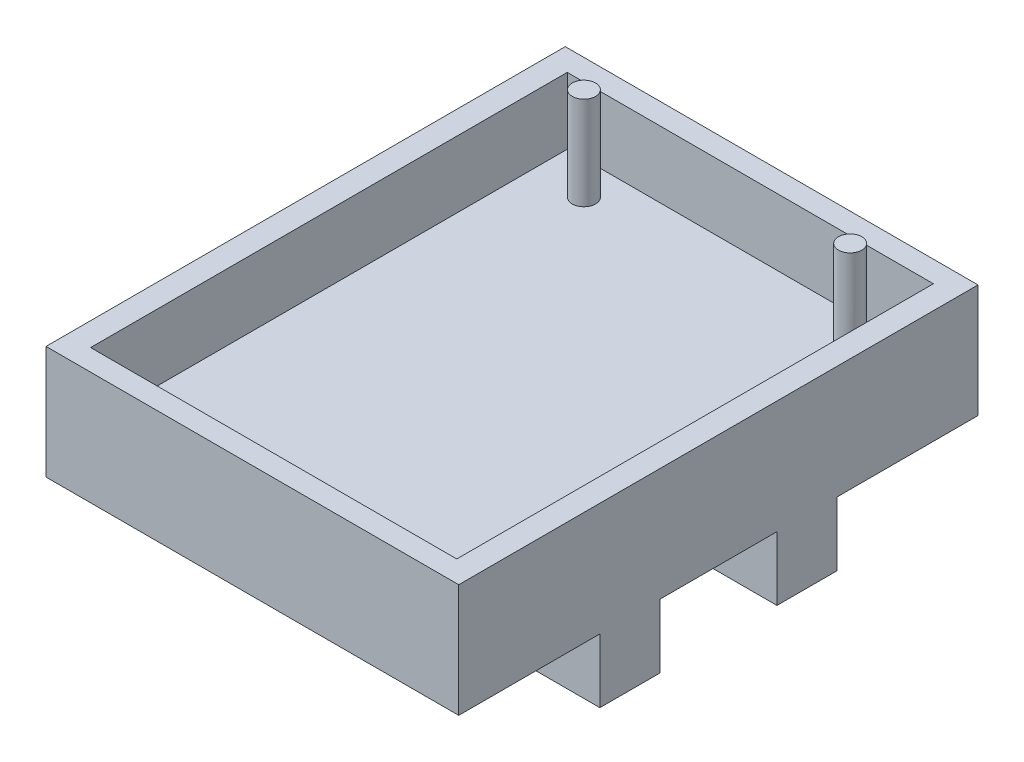
ISO-10303-21;
HEADER;
FILE_DESCRIPTION(('STEP AP214'),'2;1');
FILE_NAME('part.step','',(''),(''),'','','');
FILE_SCHEMA(('AUTOMOTIVE_DESIGN { 1 0 10303 214 1 1 1 1 }'));
ENDSEC;
DATA;
#1=APPLICATION_CONTEXT('core data for automotive mechanical design processes');
#2=APPLICATION_PROTOCOL_DEFINITION('international standard','automotive_design',2000,#1);
#3=PRODUCT_CONTEXT('',#1,'mechanical');
#4=PRODUCT('Part','Part','',(#3));
#5=PRODUCT_RELATED_PRODUCT_CATEGORY('part','',(#4));
#6=PRODUCT_DEFINITION_FORMATION('','',#4);
#7=PRODUCT_DEFINITION_CONTEXT('part definition',#1,'design');
#8=PRODUCT_DEFINITION('design','',#6,#7);
#9=PRODUCT_DEFINITION_SHAPE('','',#8);
#10=(LENGTH_UNIT() NAMED_UNIT(*) SI_UNIT(.MILLI.,.METRE.));
#11=(NAMED_UNIT(*) PLANE_ANGLE_UNIT() SI_UNIT($,.RADIAN.));
#12=(NAMED_UNIT(*) SI_UNIT($,.STERADIAN.) SOLID_ANGLE_UNIT());
#13=UNCERTAINTY_MEASURE_WITH_UNIT(LENGTH_MEASURE(1.E-05),#10,'distance_accuracy_value','');
#14=(GEOMETRIC_REPRESENTATION_CONTEXT(3) GLOBAL_UNCERTAINTY_ASSIGNED_CONTEXT((#13)) GLOBAL_UNIT_ASSIGNED_CONTEXT((#10,
#11,#12)) REPRESENTATION_CONTEXT('',''));
#15=CARTESIAN_POINT('',(0.,0.,0.));
#16=DIRECTION('',(0.,0.,1.));
#17=DIRECTION('',(1.,0.,0.));
#18=AXIS2_PLACEMENT_3D('',#15,#16,#17);
#19=CARTESIAN_POINT('',(0.,0.,0.));
#20=DIRECTION('',(0.,-1.,0.));
#21=DIRECTION('',(0.,0.,-1.));
#22=AXIS2_PLACEMENT_3D('',#19,#20,#21);
#23=PLANE('',#22);
#24=DIRECTION('',(-1.,0.,0.));
#25=VECTOR('',#24,1.);
#26=CARTESIAN_POINT('',(-15.5,0.,-8.9));
#27=LINE('',#26,#25);
#28=CARTESIAN_POINT('',(15.5,0.,-8.9));
#29=VERTEX_POINT('',#28);
#30=CARTESIAN_POINT('',(-15.5,0.,-8.9));
#31=VERTEX_POINT('',#30);
#32=EDGE_CURVE('E190',#29,#31,#27,.T.);
#33=ORIENTED_EDGE('',*,*,#32,.T.);
#34=DIRECTION('',(0.,0.,1.));
#35=VECTOR('',#34,1.);
#36=CARTESIAN_POINT('',(-15.5,0.,19.5));
#37=LINE('',#36,#35);
#38=CARTESIAN_POINT('',(-15.5,0.,-19.5));
#39=VERTEX_POINT('',#38);
#40=EDGE_CURVE('E265',#39,#31,#37,.T.);
#41=ORIENTED_EDGE('',*,*,#40,.F.);
#42=DIRECTION('',(-1.,0.,0.));
#43=VECTOR('',#42,1.);
#44=CARTESIAN_POINT('',(-15.5,0.,-19.5));
#45=LINE('',#44,#43);
#46=CARTESIAN_POINT('',(15.5,0.,-19.5));
#47=VERTEX_POINT('',#46);
#48=EDGE_CURVE('E261',#47,#39,#45,.T.);
#49=ORIENTED_EDGE('',*,*,#48,.F.);
#50=DIRECTION('',(0.,0.,-1.));
#51=VECTOR('',#50,1.);
#52=CARTESIAN_POINT('',(15.5,0.,19.5));
#53=LINE('',#52,#51);
#54=EDGE_CURVE('E62',#29,#47,#53,.T.);
#55=ORIENTED_EDGE('',*,*,#54,.F.);
#56=EDGE_LOOP('',(#33,#41,#49,#55));
#57=FACE_BOUND('',#56,.T.);
#58=ADVANCED_FACE('F39',(#57),#23,.T.);
#59=DIRECTION('',(-1.,0.,0.));
#60=VECTOR('',#59,1.);
#61=CARTESIAN_POINT('',(-15.5,0.,8.9));
#62=LINE('',#61,#60);
#63=CARTESIAN_POINT('',(15.5,0.,8.9));
#64=VERTEX_POINT('',#63);
#65=CARTESIAN_POINT('',(-15.5,0.,8.9));
#66=VERTEX_POINT('',#65);
#67=EDGE_CURVE('E225',#64,#66,#62,.T.);
#68=ORIENTED_EDGE('',*,*,#67,.F.);
#69=CARTESIAN_POINT('',(15.5,0.,19.5));
#70=VERTEX_POINT('',#69);
#71=EDGE_CURVE('E258',#70,#64,#53,.T.);
#72=ORIENTED_EDGE('',*,*,#71,.F.);
#73=DIRECTION('',(1.,0.,0.));
#74=VECTOR('',#73,1.);
#75=CARTESIAN_POINT('',(-15.5,0.,19.5));
#76=LINE('',#75,#74);
#77=CARTESIAN_POINT('',(-15.5,0.,19.5));
#78=VERTEX_POINT('',#77);
#79=EDGE_CURVE('E251',#78,#70,#76,.T.);
#80=ORIENTED_EDGE('',*,*,#79,.F.);
#81=EDGE_CURVE('E264',#66,#78,#37,.T.);
#82=ORIENTED_EDGE('',*,*,#81,.F.);
#83=EDGE_LOOP('',(#68,#72,#80,#82));
#84=FACE_BOUND('',#83,.T.);
#85=ADVANCED_FACE('F300',(#84),#23,.T.);
#86=CARTESIAN_POINT('',(15.5,8.5,19.5));
#87=DIRECTION('',(-1.,0.,0.));
#88=DIRECTION('',(0.,0.,1.));
#89=AXIS2_PLACEMENT_3D('',#86,#87,#88);
#90=PLANE('',#89);
#91=ORIENTED_EDGE('',*,*,#71,.T.);
#92=DIRECTION('',(0.,1.,0.));
#93=VECTOR('',#92,1.);
#94=CARTESIAN_POINT('',(15.5,-4.8,8.9));
#95=LINE('',#94,#93);
#96=CARTESIAN_POINT('',(15.5,-4.8,8.9));
#97=VERTEX_POINT('',#96);
#98=EDGE_CURVE('E238',#97,#64,#95,.T.);
#99=ORIENTED_EDGE('',*,*,#98,.F.);
#100=DIRECTION('',(0.,0.,1.));
#101=VECTOR('',#100,1.);
#102=CARTESIAN_POINT('',(15.5,-4.8,4.4));
#103=LINE('',#102,#101);
#104=CARTESIAN_POINT('',(15.5,-4.8,4.4));
#105=VERTEX_POINT('',#104);
#106=EDGE_CURVE('E227',#105,#97,#103,.T.);
#107=ORIENTED_EDGE('',*,*,#106,.F.);
#108=DIRECTION('',(0.,1.,0.));
#109=VECTOR('',#108,1.);
#110=CARTESIAN_POINT('',(15.5,-4.8,4.4));
#111=LINE('',#110,#109);
#112=CARTESIAN_POINT('',(15.5,0.,4.4));
#113=VERTEX_POINT('',#112);
#114=EDGE_CURVE('E241',#105,#113,#111,.T.);
#115=ORIENTED_EDGE('',*,*,#114,.T.);
#116=CARTESIAN_POINT('',(15.5,0.,-4.4));
#117=VERTEX_POINT('',#116);
#118=EDGE_CURVE('E262',#113,#117,#53,.T.);
#119=ORIENTED_EDGE('',*,*,#118,.T.);
#120=DIRECTION('',(0.,1.,0.));
#121=VECTOR('',#120,1.);
#122=CARTESIAN_POINT('',(15.5,-4.8,-4.4));
#123=LINE('',#122,#121);
#124=CARTESIAN_POINT('',(15.5,-4.8,-4.4));
#125=VERTEX_POINT('',#124);
#126=EDGE_CURVE('E212',#125,#117,#123,.T.);
#127=ORIENTED_EDGE('',*,*,#126,.F.);
#128=DIRECTION('',(0.,0.,-1.));
#129=VECTOR('',#128,1.);
#130=CARTESIAN_POINT('',(15.5,-4.8,-4.4));
#131=LINE('',#130,#129);
#132=CARTESIAN_POINT('',(15.5,-4.8,-8.9));
#133=VERTEX_POINT('',#132);
#134=EDGE_CURVE('E201',#125,#133,#131,.T.);
#135=ORIENTED_EDGE('',*,*,#134,.T.);
#136=DIRECTION('',(0.,1.,0.));
#137=VECTOR('',#136,1.);
#138=CARTESIAN_POINT('',(15.5,-4.8,-8.9));
#139=LINE('',#138,#137);
#140=EDGE_CURVE('E215',#133,#29,#139,.T.);
#141=ORIENTED_EDGE('',*,*,#140,.T.);
#142=ORIENTED_EDGE('',*,*,#54,.T.);
#143=DIRECTION('',(0.,-1.,0.));
#144=VECTOR('',#143,1.);
#145=CARTESIAN_POINT('',(15.5,8.5,-19.5));
#146=LINE('',#145,#144);
#147=CARTESIAN_POINT('',(15.5,8.5,-19.5));
#148=VERTEX_POINT('',#147);
#149=EDGE_CURVE('E278',#148,#47,#146,.T.);
#150=ORIENTED_EDGE('',*,*,#149,.F.);
#151=DIRECTION('',(0.,0.,-1.));
#152=VECTOR('',#151,1.);
#153=CARTESIAN_POINT('',(15.5,8.5,19.5));
#154=LINE('',#153,#152);
#155=CARTESIAN_POINT('',(15.5,8.5,19.5));
#156=VERTEX_POINT('',#155);
#157=EDGE_CURVE('E247',#156,#148,#154,.T.);
#158=ORIENTED_EDGE('',*,*,#157,.F.);
#159=DIRECTION('',(0.,-1.,0.));
#160=VECTOR('',#159,1.);
#161=CARTESIAN_POINT('',(15.5,8.5,19.5));
#162=LINE('',#161,#160);
#163=EDGE_CURVE('E257',#156,#70,#162,.T.);
#164=ORIENTED_EDGE('',*,*,#163,.T.);
#165=EDGE_LOOP('',(#91,#99,#107,#115,#119,#127,#135,#141,#142,#150,#158,#164));
#166=FACE_BOUND('',#165,.T.);
#167=ADVANCED_FACE('F41',(#166),#90,.F.);
#168=CARTESIAN_POINT('',(-15.5,8.5,-19.5));
#169=DIRECTION('',(0.,0.,1.));
#170=DIRECTION('',(1.,0.,0.));
#171=AXIS2_PLACEMENT_3D('',#168,#169,#170);
#172=PLANE('',#171);
#173=ORIENTED_EDGE('',*,*,#48,.T.);
#174=DIRECTION('',(0.,-1.,0.));
#175=VECTOR('',#174,1.);
#176=CARTESIAN_POINT('',(-15.5,8.5,-19.5));
#177=LINE('',#176,#175);
#178=CARTESIAN_POINT('',(-15.5,8.5,-19.5));
#179=VERTEX_POINT('',#178);
#180=EDGE_CURVE('E275',#179,#39,#177,.T.);
#181=ORIENTED_EDGE('',*,*,#180,.F.);
#182=DIRECTION('',(-1.,0.,0.));
#183=VECTOR('',#182,1.);
#184=CARTESIAN_POINT('',(-15.5,8.5,-19.5));
#185=LINE('',#184,#183);
#186=EDGE_CURVE('E250',#148,#179,#185,.T.);
#187=ORIENTED_EDGE('',*,*,#186,.F.);
#188=ORIENTED_EDGE('',*,*,#149,.T.);
#189=EDGE_LOOP('',(#173,#181,#187,#188));
#190=FACE_BOUND('',#189,.T.);
#191=ADVANCED_FACE('F347',(#190),#172,.F.);
#192=CARTESIAN_POINT('',(-15.5,8.5,19.5));
#193=DIRECTION('',(1.,0.,0.));
#194=DIRECTION('',(0.,0.,-1.));
#195=AXIS2_PLACEMENT_3D('',#192,#193,#194);
#196=PLANE('',#195);
#197=ORIENTED_EDGE('',*,*,#40,.T.);
#198=DIRECTION('',(0.,1.,0.));
#199=VECTOR('',#198,1.);
#200=CARTESIAN_POINT('',(-15.5,-4.8,-8.9));
#201=LINE('',#200,#199);
#202=CARTESIAN_POINT('',(-15.5,-4.8,-8.9));
#203=VERTEX_POINT('',#202);
#204=EDGE_CURVE('E217',#203,#31,#201,.T.);
#205=ORIENTED_EDGE('',*,*,#204,.F.);
#206=DIRECTION('',(0.,0.,1.));
#207=VECTOR('',#206,1.);
#208=CARTESIAN_POINT('',(-15.5,-4.8,-4.4));
#209=LINE('',#208,#207);
#210=CARTESIAN_POINT('',(-15.5,-4.8,-4.4));
#211=VERTEX_POINT('',#210);
#212=EDGE_CURVE('E194',#203,#211,#209,.T.);
#213=ORIENTED_EDGE('',*,*,#212,.T.);
#214=DIRECTION('',(0.,1.,0.));
#215=VECTOR('',#214,1.);
#216=CARTESIAN_POINT('',(-15.5,-4.8,-4.4));
#217=LINE('',#216,#215);
#218=CARTESIAN_POINT('',(-15.5,0.,-4.4));
#219=VERTEX_POINT('',#218);
#220=EDGE_CURVE('E207',#211,#219,#217,.T.);
#221=ORIENTED_EDGE('',*,*,#220,.T.);
#222=CARTESIAN_POINT('',(-15.5,0.,4.4));
#223=VERTEX_POINT('',#222);
#224=EDGE_CURVE('E268',#219,#223,#37,.T.);
#225=ORIENTED_EDGE('',*,*,#224,.T.);
#226=DIRECTION('',(0.,1.,0.));
#227=VECTOR('',#226,1.);
#228=CARTESIAN_POINT('',(-15.5,-4.8,4.4));
#229=LINE('',#228,#227);
#230=CARTESIAN_POINT('',(-15.5,-4.8,4.4));
#231=VERTEX_POINT('',#230);
#232=EDGE_CURVE('E244',#231,#223,#229,.T.);
#233=ORIENTED_EDGE('',*,*,#232,.F.);
#234=DIRECTION('',(0.,0.,-1.));
#235=VECTOR('',#234,1.);
#236=CARTESIAN_POINT('',(-15.5,-4.8,4.4));
#237=LINE('',#236,#235);
#238=CARTESIAN_POINT('',(-15.5,-4.8,8.9));
#239=VERTEX_POINT('',#238);
#240=EDGE_CURVE('E221',#239,#231,#237,.T.);
#241=ORIENTED_EDGE('',*,*,#240,.F.);
#242=DIRECTION('',(0.,1.,0.));
#243=VECTOR('',#242,1.);
#244=CARTESIAN_POINT('',(-15.5,-4.8,8.9));
#245=LINE('',#244,#243);
#246=EDGE_CURVE('E231',#239,#66,#245,.T.);
#247=ORIENTED_EDGE('',*,*,#246,.T.);
#248=ORIENTED_EDGE('',*,*,#81,.T.);
#249=DIRECTION('',(0.,-1.,0.));
#250=VECTOR('',#249,1.);
#251=CARTESIAN_POINT('',(-15.5,8.5,19.5));
#252=LINE('',#251,#250);
#253=CARTESIAN_POINT('',(-15.5,8.5,19.5));
#254=VERTEX_POINT('',#253);
#255=EDGE_CURVE('E272',#254,#78,#252,.T.);
#256=ORIENTED_EDGE('',*,*,#255,.F.);
#257=DIRECTION('',(0.,0.,1.));
#258=VECTOR('',#257,1.);
#259=CARTESIAN_POINT('',(-15.5,8.5,19.5));
#260=LINE('',#259,#258);
#261=EDGE_CURVE('E253',#179,#254,#260,.T.);
#262=ORIENTED_EDGE('',*,*,#261,.F.);
#263=ORIENTED_EDGE('',*,*,#180,.T.);
#264=EDGE_LOOP('',(#197,#205,#213,#221,#225,#233,#241,#247,#248,#256,#262,#263));
#265=FACE_BOUND('',#264,.T.);
#266=ADVANCED_FACE('F342',(#265),#196,.F.);
#267=CARTESIAN_POINT('',(-15.5,8.5,19.5));
#268=DIRECTION('',(0.,0.,-1.));
#269=DIRECTION('',(-1.,0.,0.));
#270=AXIS2_PLACEMENT_3D('',#267,#268,#269);
#271=PLANE('',#270);
#272=ORIENTED_EDGE('',*,*,#79,.T.);
#273=ORIENTED_EDGE('',*,*,#163,.F.);
#274=DIRECTION('',(1.,0.,0.));
#275=VECTOR('',#274,1.);
#276=CARTESIAN_POINT('',(-15.5,8.5,19.5));
#277=LINE('',#276,#275);
#278=EDGE_CURVE('E255',#254,#156,#277,.T.);
#279=ORIENTED_EDGE('',*,*,#278,.F.);
#280=ORIENTED_EDGE('',*,*,#255,.T.);
#281=EDGE_LOOP('',(#272,#273,#279,#280));
#282=FACE_BOUND('',#281,.T.);
#283=ADVANCED_FACE('F320',(#282),#271,.F.);
#284=CARTESIAN_POINT('',(0.,8.5,0.));
#285=DIRECTION('',(0.,-1.,0.));
#286=DIRECTION('',(0.,0.,-1.));
#287=AXIS2_PLACEMENT_3D('',#284,#285,#286);
#288=PLANE('',#287);
#289=DIRECTION('',(-1.,0.,0.));
#290=VECTOR('',#289,1.);
#291=CARTESIAN_POINT('',(-13.75,8.5,-17.9));
#292=LINE('',#291,#290);
#293=CARTESIAN_POINT('',(13.75,8.5,-17.9));
#294=VERTEX_POINT('',#293);
#295=CARTESIAN_POINT('',(-13.75,8.5,-17.9));
#296=VERTEX_POINT('',#295);
#297=EDGE_CURVE('E184',#294,#296,#292,.T.);
#298=ORIENTED_EDGE('',*,*,#297,.F.);
#299=DIRECTION('',(0.,0.,-1.));
#300=VECTOR('',#299,1.);
#301=CARTESIAN_POINT('',(13.75,8.5,17.9));
#302=LINE('',#301,#300);
#303=CARTESIAN_POINT('',(13.75,8.5,17.9));
#304=VERTEX_POINT('',#303);
#305=EDGE_CURVE('E54',#304,#294,#302,.T.);
#306=ORIENTED_EDGE('',*,*,#305,.F.);
#307=DIRECTION('',(1.,0.,0.));
#308=VECTOR('',#307,1.);
#309=CARTESIAN_POINT('',(-13.75,8.5,17.9));
#310=LINE('',#309,#308);
#311=CARTESIAN_POINT('',(-13.75,8.5,17.9));
#312=VERTEX_POINT('',#311);
#313=EDGE_CURVE('E172',#312,#304,#310,.T.);
#314=ORIENTED_EDGE('',*,*,#313,.F.);
#315=DIRECTION('',(0.,0.,1.));
#316=VECTOR('',#315,1.);
#317=CARTESIAN_POINT('',(-13.75,8.5,17.9));
#318=LINE('',#317,#316);
#319=EDGE_CURVE('E175',#296,#312,#318,.T.);
#320=ORIENTED_EDGE('',*,*,#319,.F.);
#321=EDGE_LOOP('',(#298,#306,#314,#320));
#322=FACE_BOUND('',#321,.T.);
#323=ORIENTED_EDGE('',*,*,#157,.T.);
#324=ORIENTED_EDGE('',*,*,#186,.T.);
#325=ORIENTED_EDGE('',*,*,#261,.T.);
#326=ORIENTED_EDGE('',*,*,#278,.T.);
#327=EDGE_LOOP('',(#323,#324,#325,#326));
#328=FACE_BOUND('',#327,.T.);
#329=ADVANCED_FACE('F311',(#322,#328),#288,.F.);
#330=DIRECTION('',(1.,0.,0.));
#331=VECTOR('',#330,1.);
#332=CARTESIAN_POINT('',(-15.5,0.,-4.4));
#333=LINE('',#332,#331);
#334=EDGE_CURVE('E198',#219,#117,#333,.T.);
#335=ORIENTED_EDGE('',*,*,#334,.T.);
#336=ORIENTED_EDGE('',*,*,#118,.F.);
#337=DIRECTION('',(1.,0.,0.));
#338=VECTOR('',#337,1.);
#339=CARTESIAN_POINT('',(-15.5,0.,4.4));
#340=LINE('',#339,#338);
#341=EDGE_CURVE('E220',#223,#113,#340,.T.);
#342=ORIENTED_EDGE('',*,*,#341,.F.);
#343=ORIENTED_EDGE('',*,*,#224,.F.);
#344=EDGE_LOOP('',(#335,#336,#342,#343));
#345=FACE_BOUND('',#344,.T.);
#346=ADVANCED_FACE('F302',(#345),#23,.T.);
#347=CARTESIAN_POINT('',(-15.5,-4.8,4.4));
#348=DIRECTION('',(0.,0.,1.));
#349=DIRECTION('',(1.,0.,0.));
#350=AXIS2_PLACEMENT_3D('',#347,#348,#349);
#351=PLANE('',#350);
#352=ORIENTED_EDGE('',*,*,#341,.T.);
#353=ORIENTED_EDGE('',*,*,#114,.F.);
#354=DIRECTION('',(1.,0.,0.));
#355=VECTOR('',#354,1.);
#356=CARTESIAN_POINT('',(-15.5,-4.8,4.4));
#357=LINE('',#356,#355);
#358=EDGE_CURVE('E224',#231,#105,#357,.T.);
#359=ORIENTED_EDGE('',*,*,#358,.F.);
#360=ORIENTED_EDGE('',*,*,#232,.T.);
#361=EDGE_LOOP('',(#352,#353,#359,#360));
#362=FACE_BOUND('',#361,.T.);
#363=ADVANCED_FACE('F310',(#362),#351,.F.);
#364=CARTESIAN_POINT('',(-15.5,-4.8,8.9));
#365=DIRECTION('',(0.,0.,-1.));
#366=DIRECTION('',(-1.,0.,0.));
#367=AXIS2_PLACEMENT_3D('',#364,#365,#366);
#368=PLANE('',#367);
#369=ORIENTED_EDGE('',*,*,#67,.T.);
#370=ORIENTED_EDGE('',*,*,#246,.F.);
#371=DIRECTION('',(-1.,0.,0.));
#372=VECTOR('',#371,1.);
#373=CARTESIAN_POINT('',(-15.5,-4.8,8.9));
#374=LINE('',#373,#372);
#375=EDGE_CURVE('E229',#97,#239,#374,.T.);
#376=ORIENTED_EDGE('',*,*,#375,.F.);
#377=ORIENTED_EDGE('',*,*,#98,.T.);
#378=EDGE_LOOP('',(#369,#370,#376,#377));
#379=FACE_BOUND('',#378,.T.);
#380=ADVANCED_FACE('F317',(#379),#368,.F.);
#381=CARTESIAN_POINT('',(0.,-4.8,0.));
#382=DIRECTION('',(0.,1.,0.));
#383=DIRECTION('',(0.,0.,1.));
#384=AXIS2_PLACEMENT_3D('',#381,#382,#383);
#385=PLANE('',#384);
#386=ORIENTED_EDGE('',*,*,#240,.T.);
#387=ORIENTED_EDGE('',*,*,#358,.T.);
#388=ORIENTED_EDGE('',*,*,#106,.T.);
#389=ORIENTED_EDGE('',*,*,#375,.T.);
#390=EDGE_LOOP('',(#386,#387,#388,#389));
#391=FACE_BOUND('',#390,.T.);
#392=ADVANCED_FACE('F361',(#391),#385,.F.);
#393=CARTESIAN_POINT('',(-15.5,-4.8,-8.9));
#394=DIRECTION('',(0.,0.,-1.));
#395=DIRECTION('',(-1.,0.,0.));
#396=AXIS2_PLACEMENT_3D('',#393,#394,#395);
#397=PLANE('',#396);
#398=ORIENTED_EDGE('',*,*,#32,.F.);
#399=ORIENTED_EDGE('',*,*,#140,.F.);
#400=DIRECTION('',(-1.,0.,0.));
#401=VECTOR('',#400,1.);
#402=CARTESIAN_POINT('',(-15.5,-4.8,-8.9));
#403=LINE('',#402,#401);
#404=EDGE_CURVE('E197',#133,#203,#403,.T.);
#405=ORIENTED_EDGE('',*,*,#404,.T.);
#406=ORIENTED_EDGE('',*,*,#204,.T.);
#407=EDGE_LOOP('',(#398,#399,#405,#406));
#408=FACE_BOUND('',#407,.T.);
#409=ADVANCED_FACE('F339',(#408),#397,.T.);
#410=CARTESIAN_POINT('',(-15.5,-4.8,-4.4));
#411=DIRECTION('',(0.,0.,1.));
#412=DIRECTION('',(1.,0.,0.));
#413=AXIS2_PLACEMENT_3D('',#410,#411,#412);
#414=PLANE('',#413);
#415=ORIENTED_EDGE('',*,*,#334,.F.);
#416=ORIENTED_EDGE('',*,*,#220,.F.);
#417=DIRECTION('',(1.,0.,0.));
#418=VECTOR('',#417,1.);
#419=CARTESIAN_POINT('',(-15.5,-4.8,-4.4));
#420=LINE('',#419,#418);
#421=EDGE_CURVE('E204',#211,#125,#420,.T.);
#422=ORIENTED_EDGE('',*,*,#421,.T.);
#423=ORIENTED_EDGE('',*,*,#126,.T.);
#424=EDGE_LOOP('',(#415,#416,#422,#423));
#425=FACE_BOUND('',#424,.T.);
#426=ADVANCED_FACE('F330',(#425),#414,.T.);
#427=CARTESIAN_POINT('',(0.,-4.8,0.));
#428=DIRECTION('',(0.,1.,0.));
#429=DIRECTION('',(0.,0.,-1.));
#430=AXIS2_PLACEMENT_3D('',#427,#428,#429);
#431=PLANE('',#430);
#432=ORIENTED_EDGE('',*,*,#212,.F.);
#433=ORIENTED_EDGE('',*,*,#404,.F.);
#434=ORIENTED_EDGE('',*,*,#134,.F.);
#435=ORIENTED_EDGE('',*,*,#421,.F.);
#436=EDGE_LOOP('',(#432,#433,#434,#435));
#437=FACE_BOUND('',#436,.T.);
#438=ADVANCED_FACE('F334',(#437),#431,.F.);
#439=CARTESIAN_POINT('',(13.75,3.5,17.9));
#440=DIRECTION('',(1.,0.,0.));
#441=DIRECTION('',(0.,0.,-1.));
#442=AXIS2_PLACEMENT_3D('',#439,#440,#441);
#443=PLANE('',#442);
#444=ORIENTED_EDGE('',*,*,#305,.T.);
#445=DIRECTION('',(0.,1.,0.));
#446=VECTOR('',#445,1.);
#447=CARTESIAN_POINT('',(13.75,3.5,-17.9));
#448=LINE('',#447,#446);
#449=CARTESIAN_POINT('',(13.75,3.5,-17.9));
#450=VERTEX_POINT('',#449);
#451=EDGE_CURVE('E150',#450,#294,#448,.T.);
#452=ORIENTED_EDGE('',*,*,#451,.F.);
#453=DIRECTION('',(0.,0.,-1.));
#454=VECTOR('',#453,1.);
#455=CARTESIAN_POINT('',(13.75,3.5,17.9));
#456=LINE('',#455,#454);
#457=CARTESIAN_POINT('',(13.75,3.5,17.9));
#458=VERTEX_POINT('',#457);
#459=EDGE_CURVE('E154',#458,#450,#456,.T.);
#460=ORIENTED_EDGE('',*,*,#459,.F.);
#461=DIRECTION('',(0.,1.,0.));
#462=VECTOR('',#461,1.);
#463=CARTESIAN_POINT('',(13.75,3.5,17.9));
#464=LINE('',#463,#462);
#465=EDGE_CURVE('E188',#458,#304,#464,.T.);
#466=ORIENTED_EDGE('',*,*,#465,.T.);
#467=EDGE_LOOP('',(#444,#452,#460,#466));
#468=FACE_BOUND('',#467,.T.);
#469=ADVANCED_FACE('F152',(#468),#443,.F.);
#470=CARTESIAN_POINT('',(-13.75,3.5,17.9));
#471=DIRECTION('',(0.,0.,1.));
#472=DIRECTION('',(1.,0.,0.));
#473=AXIS2_PLACEMENT_3D('',#470,#471,#472);
#474=PLANE('',#473);
#475=ORIENTED_EDGE('',*,*,#313,.T.);
#476=ORIENTED_EDGE('',*,*,#465,.F.);
#477=DIRECTION('',(1.,0.,0.));
#478=VECTOR('',#477,1.);
#479=CARTESIAN_POINT('',(-13.75,3.5,17.9));
#480=LINE('',#479,#478);
#481=CARTESIAN_POINT('',(-13.75,3.5,17.9));
#482=VERTEX_POINT('',#481);
#483=EDGE_CURVE('E160',#482,#458,#480,.T.);
#484=ORIENTED_EDGE('',*,*,#483,.F.);
#485=DIRECTION('',(0.,1.,0.));
#486=VECTOR('',#485,1.);
#487=CARTESIAN_POINT('',(-13.75,3.5,17.9));
#488=LINE('',#487,#486);
#489=EDGE_CURVE('E191',#482,#312,#488,.T.);
#490=ORIENTED_EDGE('',*,*,#489,.T.);
#491=EDGE_LOOP('',(#475,#476,#484,#490));
#492=FACE_BOUND('',#491,.T.);
#493=ADVANCED_FACE('F377',(#492),#474,.F.);
#494=CARTESIAN_POINT('',(-13.75,3.5,17.9));
#495=DIRECTION('',(-1.,0.,0.));
#496=DIRECTION('',(0.,0.,1.));
#497=AXIS2_PLACEMENT_3D('',#494,#495,#496);
#498=PLANE('',#497);
#499=ORIENTED_EDGE('',*,*,#319,.T.);
#500=ORIENTED_EDGE('',*,*,#489,.F.);
#501=DIRECTION('',(0.,0.,1.));
#502=VECTOR('',#501,1.);
#503=CARTESIAN_POINT('',(-13.75,3.5,17.9));
#504=LINE('',#503,#502);
#505=CARTESIAN_POINT('',(-13.75,3.5,-17.9));
#506=VERTEX_POINT('',#505);
#507=EDGE_CURVE('E168',#506,#482,#504,.T.);
#508=ORIENTED_EDGE('',*,*,#507,.F.);
#509=DIRECTION('',(0.,1.,0.));
#510=VECTOR('',#509,1.);
#511=CARTESIAN_POINT('',(-13.75,3.5,-17.9));
#512=LINE('',#511,#510);
#513=EDGE_CURVE('E159',#506,#296,#512,.T.);
#514=ORIENTED_EDGE('',*,*,#513,.T.);
#515=EDGE_LOOP('',(#499,#500,#508,#514));
#516=FACE_BOUND('',#515,.T.);
#517=ADVANCED_FACE('F295',(#516),#498,.F.);
#518=CARTESIAN_POINT('',(-13.75,3.5,-17.9));
#519=DIRECTION('',(0.,0.,-1.));
#520=DIRECTION('',(-1.,0.,0.));
#521=AXIS2_PLACEMENT_3D('',#518,#519,#520);
#522=PLANE('',#521);
#523=ORIENTED_EDGE('',*,*,#297,.T.);
#524=ORIENTED_EDGE('',*,*,#513,.F.);
#525=DIRECTION('',(-1.,0.,0.));
#526=VECTOR('',#525,1.);
#527=CARTESIAN_POINT('',(-13.75,3.5,-17.9));
#528=LINE('',#527,#526);
#529=EDGE_CURVE('E163',#450,#506,#528,.T.);
#530=ORIENTED_EDGE('',*,*,#529,.F.);
#531=ORIENTED_EDGE('',*,*,#451,.T.);
#532=EDGE_LOOP('',(#523,#524,#530,#531));
#533=FACE_BOUND('',#532,.T.);
#534=ADVANCED_FACE('F164',(#533),#522,.F.);
#535=CARTESIAN_POINT('',(0.,3.5,0.));
#536=DIRECTION('',(0.,-1.,0.));
#537=DIRECTION('',(0.,0.,-1.));
#538=AXIS2_PLACEMENT_3D('',#535,#536,#537);
#539=PLANE('',#538);
#540=CARTESIAN_POINT('',(10.,3.5,-15.4));
#541=DIRECTION('',(0.,-1.,0.));
#542=DIRECTION('',(0.,0.,-1.));
#543=AXIS2_PLACEMENT_3D('',#540,#541,#542);
#544=CIRCLE('',#543,0.875);
#545=CARTESIAN_POINT('',(10.,3.5,-16.275));
#546=VERTEX_POINT('',#545);
#547=EDGE_CURVE('E11',#546,#546,#544,.F.);
#548=ORIENTED_EDGE('',*,*,#547,.F.);
#549=EDGE_LOOP('',(#548));
#550=FACE_BOUND('',#549,.T.);
#551=CARTESIAN_POINT('',(-10.,3.5,-15.4));
#552=DIRECTION('',(0.,-1.,0.));
#553=DIRECTION('',(0.,0.,-1.));
#554=AXIS2_PLACEMENT_3D('',#551,#552,#553);
#555=CIRCLE('',#554,0.875);
#556=CARTESIAN_POINT('',(-10.,3.5,-16.275));
#557=VERTEX_POINT('',#556);
#558=EDGE_CURVE('E47',#557,#557,#555,.F.);
#559=ORIENTED_EDGE('',*,*,#558,.F.);
#560=EDGE_LOOP('',(#559));
#561=FACE_BOUND('',#560,.T.);
#562=ORIENTED_EDGE('',*,*,#459,.T.);
#563=ORIENTED_EDGE('',*,*,#529,.T.);
#564=ORIENTED_EDGE('',*,*,#507,.T.);
#565=ORIENTED_EDGE('',*,*,#483,.T.);
#566=EDGE_LOOP('',(#562,#563,#564,#565));
#567=FACE_BOUND('',#566,.T.);
#568=ADVANCED_FACE('F170',(#550,#561,#567),#539,.F.);
#569=CARTESIAN_POINT('',(-10.,10.5,-15.4));
#570=DIRECTION('',(0.,-1.,0.));
#571=DIRECTION('',(0.,0.,-1.));
#572=AXIS2_PLACEMENT_3D('',#569,#570,#571);
#573=CYLINDRICAL_SURFACE('',#572,0.875);
#574=CARTESIAN_POINT('',(-10.,10.5,-15.4));
#575=DIRECTION('',(0.,1.,0.));
#576=DIRECTION('',(0.,0.,1.));
#577=AXIS2_PLACEMENT_3D('',#574,#575,#576);
#578=CIRCLE('',#577,0.875);
#579=CARTESIAN_POINT('',(-10.,10.5,-14.525));
#580=VERTEX_POINT('',#579);
#581=EDGE_CURVE('E178',#580,#580,#578,.T.);
#582=ORIENTED_EDGE('',*,*,#581,.F.);
#583=EDGE_LOOP('',(#582));
#584=FACE_BOUND('',#583,.T.);
#585=ORIENTED_EDGE('',*,*,#558,.T.);
#586=EDGE_LOOP('',(#585));
#587=FACE_BOUND('',#586,.T.);
#588=ADVANCED_FACE('F283',(#584,#587),#573,.T.);
#589=CARTESIAN_POINT('',(-10.,10.5,-15.4));
#590=DIRECTION('',(0.,1.,0.));
#591=DIRECTION('',(0.,0.,1.));
#592=AXIS2_PLACEMENT_3D('',#589,#590,#591);
#593=PLANE('',#592);
#594=ORIENTED_EDGE('',*,*,#581,.T.);
#595=EDGE_LOOP('',(#594));
#596=FACE_BOUND('',#595,.T.);
#597=ADVANCED_FACE('F292',(#596),#593,.T.);
#598=CARTESIAN_POINT('',(10.,10.5,-15.4));
#599=DIRECTION('',(0.,-1.,0.));
#600=DIRECTION('',(0.,0.,-1.));
#601=AXIS2_PLACEMENT_3D('',#598,#599,#600);
#602=CYLINDRICAL_SURFACE('',#601,0.875);
#603=CARTESIAN_POINT('',(10.,10.5,-15.4));
#604=DIRECTION('',(0.,1.,0.));
#605=DIRECTION('',(0.,0.,1.));
#606=AXIS2_PLACEMENT_3D('',#603,#604,#605);
#607=CIRCLE('',#606,0.875);
#608=CARTESIAN_POINT('',(10.,10.5,-14.525));
#609=VERTEX_POINT('',#608);
#610=EDGE_CURVE('E591',#609,#609,#607,.T.);
#611=ORIENTED_EDGE('',*,*,#610,.F.);
#612=EDGE_LOOP('',(#611));
#613=FACE_BOUND('',#612,.T.);
#614=ORIENTED_EDGE('',*,*,#547,.T.);
#615=EDGE_LOOP('',(#614));
#616=FACE_BOUND('',#615,.T.);
#617=ADVANCED_FACE('F419',(#613,#616),#602,.T.);
#618=CARTESIAN_POINT('',(10.,10.5,-15.4));
#619=DIRECTION('',(0.,1.,0.));
#620=DIRECTION('',(0.,0.,1.));
#621=AXIS2_PLACEMENT_3D('',#618,#619,#620);
#622=PLANE('',#621);
#623=ORIENTED_EDGE('',*,*,#610,.T.);
#624=EDGE_LOOP('',(#623));
#625=FACE_BOUND('',#624,.T.);
#626=ADVANCED_FACE('F430',(#625),#622,.T.);
#627=CLOSED_SHELL('',(#58,#85,#167,#191,#266,#283,#329,#346,#363,#380,#392,#409,#426,#438,#469,
#493,#517,#534,#568,#588,#597,#617,#626));
#628=MANIFOLD_SOLID_BREP('B2',#627);
#629=ADVANCED_BREP_SHAPE_REPRESENTATION('',(#18,#628),#14);
#630=SHAPE_DEFINITION_REPRESENTATION(#9,#629);
ENDSEC;
END-ISO-10303-21;
